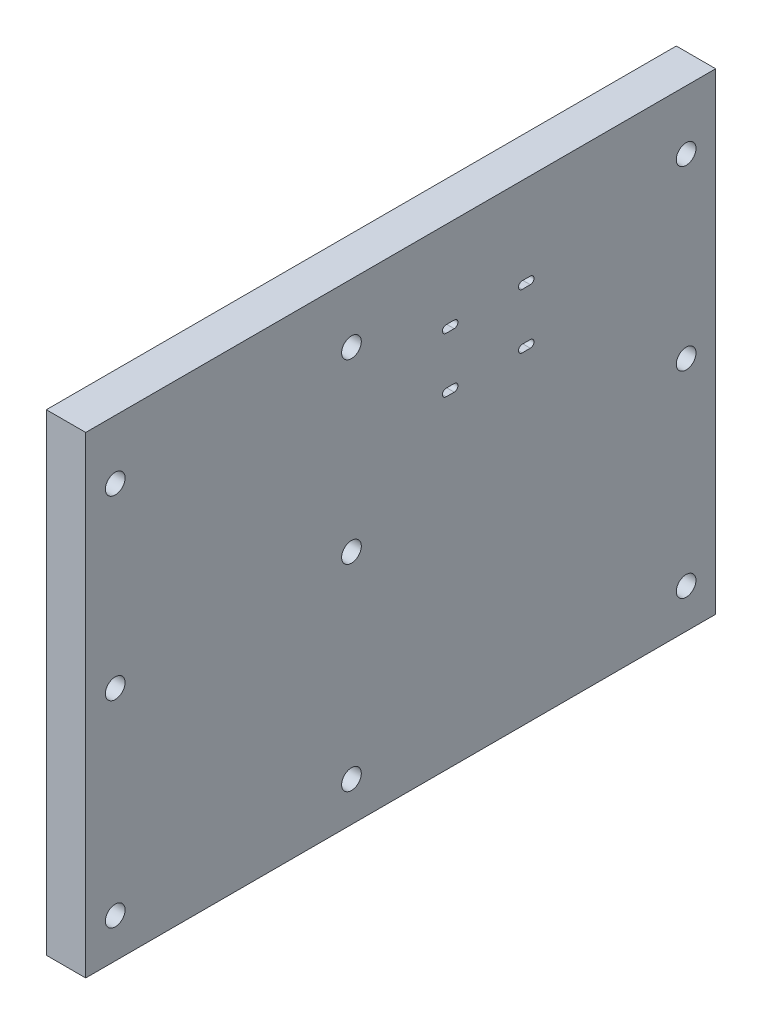
ISO-10303-21;
HEADER;
FILE_DESCRIPTION(('STEP AP214'),'2;1');
FILE_NAME('part.step','',(''),(''),'','','');
FILE_SCHEMA(('AUTOMOTIVE_DESIGN { 1 0 10303 214 1 1 1 1 }'));
ENDSEC;
DATA;
#1=APPLICATION_CONTEXT('core data for automotive mechanical design processes');
#2=APPLICATION_PROTOCOL_DEFINITION('international standard','automotive_design',2000,#1);
#3=PRODUCT_CONTEXT('',#1,'mechanical');
#4=PRODUCT('Part','Part','',(#3));
#5=PRODUCT_RELATED_PRODUCT_CATEGORY('part','',(#4));
#6=PRODUCT_DEFINITION_FORMATION('','',#4);
#7=PRODUCT_DEFINITION_CONTEXT('part definition',#1,'design');
#8=PRODUCT_DEFINITION('design','',#6,#7);
#9=PRODUCT_DEFINITION_SHAPE('','',#8);
#10=(LENGTH_UNIT() NAMED_UNIT(*) SI_UNIT(.MILLI.,.METRE.));
#11=(NAMED_UNIT(*) PLANE_ANGLE_UNIT() SI_UNIT($,.RADIAN.));
#12=(NAMED_UNIT(*) SI_UNIT($,.STERADIAN.) SOLID_ANGLE_UNIT());
#13=UNCERTAINTY_MEASURE_WITH_UNIT(LENGTH_MEASURE(1.E-05),#10,'distance_accuracy_value','');
#14=(GEOMETRIC_REPRESENTATION_CONTEXT(3) GLOBAL_UNCERTAINTY_ASSIGNED_CONTEXT((#13)) GLOBAL_UNIT_ASSIGNED_CONTEXT((#10,
#11,#12)) REPRESENTATION_CONTEXT('',''));
#15=CARTESIAN_POINT('',(0.,0.,0.));
#16=DIRECTION('',(0.,0.,1.));
#17=DIRECTION('',(1.,0.,0.));
#18=AXIS2_PLACEMENT_3D('',#15,#16,#17);
#19=CARTESIAN_POINT('',(12.7,46.97,-39.2012106466433));
#20=DIRECTION('',(-1.,0.,0.));
#21=DIRECTION('',(0.,0.,1.));
#22=AXIS2_PLACEMENT_3D('',#19,#20,#21);
#23=CYLINDRICAL_SURFACE('',#22,1.2);
#24=CARTESIAN_POINT('',(0.,46.97,-39.2012106466433));
#25=DIRECTION('',(1.,0.,0.));
#26=DIRECTION('',(0.,0.,-1.));
#27=AXIS2_PLACEMENT_3D('',#24,#25,#26);
#28=CIRCLE('',#27,1.2);
#29=CARTESIAN_POINT('',(0.,48.17,-39.2012106466433));
#30=VERTEX_POINT('',#29);
#31=CARTESIAN_POINT('',(0.,45.77,-39.2012106466433));
#32=VERTEX_POINT('',#31);
#33=EDGE_CURVE('E312',#30,#32,#28,.T.);
#34=ORIENTED_EDGE('',*,*,#33,.F.);
#35=DIRECTION('',(-1.,0.,0.));
#36=VECTOR('',#35,1.);
#37=CARTESIAN_POINT('',(12.7,48.17,-39.2012106466433));
#38=LINE('',#37,#36);
#39=CARTESIAN_POINT('',(12.7,48.17,-39.2012106466433));
#40=VERTEX_POINT('',#39);
#41=EDGE_CURVE('E11',#40,#30,#38,.T.);
#42=ORIENTED_EDGE('',*,*,#41,.F.);
#43=CARTESIAN_POINT('',(12.7,46.97,-39.2012106466433));
#44=DIRECTION('',(1.,0.,0.));
#45=DIRECTION('',(0.,0.,-1.));
#46=AXIS2_PLACEMENT_3D('',#43,#44,#45);
#47=CIRCLE('',#46,1.2);
#48=CARTESIAN_POINT('',(12.7,45.77,-39.2012106466433));
#49=VERTEX_POINT('',#48);
#50=EDGE_CURVE('E223',#40,#49,#47,.T.);
#51=ORIENTED_EDGE('',*,*,#50,.T.);
#52=DIRECTION('',(-1.,0.,0.));
#53=VECTOR('',#52,1.);
#54=CARTESIAN_POINT('',(12.7,45.77,-39.2012106466433));
#55=LINE('',#54,#53);
#56=EDGE_CURVE('E144',#49,#32,#55,.T.);
#57=ORIENTED_EDGE('',*,*,#56,.T.);
#58=EDGE_LOOP('',(#34,#42,#51,#57));
#59=FACE_BOUND('',#58,.T.);
#60=ADVANCED_FACE('F51',(#59),#23,.F.);
#61=CARTESIAN_POINT('',(12.7,48.17,0.));
#62=DIRECTION('',(0.,-1.,0.));
#63=DIRECTION('',(0.,0.,-1.));
#64=AXIS2_PLACEMENT_3D('',#61,#62,#63);
#65=PLANE('',#64);
#66=DIRECTION('',(0.,0.,1.));
#67=VECTOR('',#66,1.);
#68=CARTESIAN_POINT('',(0.,48.17,0.));
#69=LINE('',#68,#67);
#70=CARTESIAN_POINT('',(0.,48.17,-41.8012106466433));
#71=VERTEX_POINT('',#70);
#72=EDGE_CURVE('E215',#71,#30,#69,.T.);
#73=ORIENTED_EDGE('',*,*,#72,.F.);
#74=DIRECTION('',(-1.,0.,0.));
#75=VECTOR('',#74,1.);
#76=CARTESIAN_POINT('',(12.7,48.17,-41.8012106466433));
#77=LINE('',#76,#75);
#78=CARTESIAN_POINT('',(12.7,48.17,-41.8012106466433));
#79=VERTEX_POINT('',#78);
#80=EDGE_CURVE('E61',#79,#71,#77,.T.);
#81=ORIENTED_EDGE('',*,*,#80,.F.);
#82=DIRECTION('',(0.,0.,1.));
#83=VECTOR('',#82,1.);
#84=CARTESIAN_POINT('',(12.7,48.17,0.));
#85=LINE('',#84,#83);
#86=EDGE_CURVE('E213',#79,#40,#85,.T.);
#87=ORIENTED_EDGE('',*,*,#86,.T.);
#88=ORIENTED_EDGE('',*,*,#41,.T.);
#89=EDGE_LOOP('',(#73,#81,#87,#88));
#90=FACE_BOUND('',#89,.T.);
#91=ADVANCED_FACE('F212',(#90),#65,.T.);
#92=CARTESIAN_POINT('',(12.7,46.97,-41.8012106466433));
#93=DIRECTION('',(-1.,0.,0.));
#94=DIRECTION('',(0.,0.,1.));
#95=AXIS2_PLACEMENT_3D('',#92,#93,#94);
#96=CYLINDRICAL_SURFACE('',#95,1.2);
#97=CARTESIAN_POINT('',(0.,46.97,-41.8012106466433));
#98=DIRECTION('',(1.,0.,0.));
#99=DIRECTION('',(0.,0.,-1.));
#100=AXIS2_PLACEMENT_3D('',#97,#98,#99);
#101=CIRCLE('',#100,1.2);
#102=CARTESIAN_POINT('',(0.,45.77,-41.8012106466433));
#103=VERTEX_POINT('',#102);
#104=EDGE_CURVE('E316',#103,#71,#101,.T.);
#105=ORIENTED_EDGE('',*,*,#104,.F.);
#106=DIRECTION('',(-1.,0.,0.));
#107=VECTOR('',#106,1.);
#108=CARTESIAN_POINT('',(12.7,45.77,-41.8012106466433));
#109=LINE('',#108,#107);
#110=CARTESIAN_POINT('',(12.7,45.77,-41.8012106466433));
#111=VERTEX_POINT('',#110);
#112=EDGE_CURVE('E137',#111,#103,#109,.T.);
#113=ORIENTED_EDGE('',*,*,#112,.F.);
#114=CARTESIAN_POINT('',(12.7,46.97,-41.8012106466433));
#115=DIRECTION('',(1.,0.,0.));
#116=DIRECTION('',(0.,0.,-1.));
#117=AXIS2_PLACEMENT_3D('',#114,#115,#116);
#118=CIRCLE('',#117,1.2);
#119=EDGE_CURVE('E222',#111,#79,#118,.T.);
#120=ORIENTED_EDGE('',*,*,#119,.T.);
#121=ORIENTED_EDGE('',*,*,#80,.T.);
#122=EDGE_LOOP('',(#105,#113,#120,#121));
#123=FACE_BOUND('',#122,.T.);
#124=ADVANCED_FACE('F225',(#123),#96,.F.);
#125=CARTESIAN_POINT('',(12.7,30.43,0.));
#126=DIRECTION('',(0.,-1.,0.));
#127=DIRECTION('',(0.,0.,-1.));
#128=AXIS2_PLACEMENT_3D('',#125,#126,#127);
#129=PLANE('',#128);
#130=DIRECTION('',(0.,0.,1.));
#131=VECTOR('',#130,1.);
#132=CARTESIAN_POINT('',(0.,30.43,0.));
#133=LINE('',#132,#131);
#134=CARTESIAN_POINT('',(0.,30.43,-41.8012106466433));
#135=VERTEX_POINT('',#134);
#136=CARTESIAN_POINT('',(0.,30.43,-39.2012106466433));
#137=VERTEX_POINT('',#136);
#138=EDGE_CURVE('E299',#135,#137,#133,.T.);
#139=ORIENTED_EDGE('',*,*,#138,.F.);
#140=DIRECTION('',(-1.,0.,0.));
#141=VECTOR('',#140,1.);
#142=CARTESIAN_POINT('',(12.7,30.43,-41.8012106466433));
#143=LINE('',#142,#141);
#144=CARTESIAN_POINT('',(12.7,30.43,-41.8012106466433));
#145=VERTEX_POINT('',#144);
#146=EDGE_CURVE('E322',#145,#135,#143,.T.);
#147=ORIENTED_EDGE('',*,*,#146,.F.);
#148=DIRECTION('',(0.,0.,1.));
#149=VECTOR('',#148,1.);
#150=CARTESIAN_POINT('',(12.7,30.43,0.));
#151=LINE('',#150,#149);
#152=CARTESIAN_POINT('',(12.7,30.43,-39.2012106466433));
#153=VERTEX_POINT('',#152);
#154=EDGE_CURVE('E422',#145,#153,#151,.T.);
#155=ORIENTED_EDGE('',*,*,#154,.T.);
#156=DIRECTION('',(-1.,0.,0.));
#157=VECTOR('',#156,1.);
#158=CARTESIAN_POINT('',(12.7,30.43,-39.2012106466433));
#159=LINE('',#158,#157);
#160=EDGE_CURVE('E324',#153,#137,#159,.T.);
#161=ORIENTED_EDGE('',*,*,#160,.T.);
#162=EDGE_LOOP('',(#139,#147,#155,#161));
#163=FACE_BOUND('',#162,.T.);
#164=ADVANCED_FACE('F470',(#163),#129,.T.);
#165=CARTESIAN_POINT('',(12.7,29.23,-41.8012106466433));
#166=DIRECTION('',(-1.,0.,0.));
#167=DIRECTION('',(0.,0.,1.));
#168=AXIS2_PLACEMENT_3D('',#165,#166,#167);
#169=CYLINDRICAL_SURFACE('',#168,1.2);
#170=CARTESIAN_POINT('',(0.,29.23,-41.8012106466433));
#171=DIRECTION('',(1.,0.,0.));
#172=DIRECTION('',(0.,0.,-1.));
#173=AXIS2_PLACEMENT_3D('',#170,#171,#172);
#174=CIRCLE('',#173,1.2);
#175=CARTESIAN_POINT('',(0.,28.03,-41.8012106466433));
#176=VERTEX_POINT('',#175);
#177=EDGE_CURVE('E302',#135,#176,#174,.F.);
#178=ORIENTED_EDGE('',*,*,#177,.T.);
#179=DIRECTION('',(-1.,0.,0.));
#180=VECTOR('',#179,1.);
#181=CARTESIAN_POINT('',(12.7,28.03,-41.8012106466433));
#182=LINE('',#181,#180);
#183=CARTESIAN_POINT('',(12.7,28.03,-41.8012106466433));
#184=VERTEX_POINT('',#183);
#185=EDGE_CURVE('E332',#184,#176,#182,.T.);
#186=ORIENTED_EDGE('',*,*,#185,.F.);
#187=CARTESIAN_POINT('',(12.7,29.23,-41.8012106466433));
#188=DIRECTION('',(1.,0.,0.));
#189=DIRECTION('',(0.,0.,-1.));
#190=AXIS2_PLACEMENT_3D('',#187,#188,#189);
#191=CIRCLE('',#190,1.2);
#192=EDGE_CURVE('E426',#145,#184,#191,.F.);
#193=ORIENTED_EDGE('',*,*,#192,.F.);
#194=ORIENTED_EDGE('',*,*,#146,.T.);
#195=EDGE_LOOP('',(#178,#186,#193,#194));
#196=FACE_BOUND('',#195,.T.);
#197=ADVANCED_FACE('F466',(#196),#169,.F.);
#198=CARTESIAN_POINT('',(12.7,28.03,0.));
#199=DIRECTION('',(0.,-1.,0.));
#200=DIRECTION('',(0.,0.,-1.));
#201=AXIS2_PLACEMENT_3D('',#198,#199,#200);
#202=PLANE('',#201);
#203=DIRECTION('',(0.,0.,1.));
#204=VECTOR('',#203,1.);
#205=CARTESIAN_POINT('',(0.,28.03,0.));
#206=LINE('',#205,#204);
#207=CARTESIAN_POINT('',(0.,28.03,-39.2012106466433));
#208=VERTEX_POINT('',#207);
#209=EDGE_CURVE('E305',#176,#208,#206,.T.);
#210=ORIENTED_EDGE('',*,*,#209,.T.);
#211=DIRECTION('',(-1.,0.,0.));
#212=VECTOR('',#211,1.);
#213=CARTESIAN_POINT('',(12.7,28.03,-39.2012106466433));
#214=LINE('',#213,#212);
#215=CARTESIAN_POINT('',(12.7,28.03,-39.2012106466433));
#216=VERTEX_POINT('',#215);
#217=EDGE_CURVE('E327',#216,#208,#214,.T.);
#218=ORIENTED_EDGE('',*,*,#217,.F.);
#219=DIRECTION('',(0.,0.,1.));
#220=VECTOR('',#219,1.);
#221=CARTESIAN_POINT('',(12.7,28.03,0.));
#222=LINE('',#221,#220);
#223=EDGE_CURVE('E429',#184,#216,#222,.T.);
#224=ORIENTED_EDGE('',*,*,#223,.F.);
#225=ORIENTED_EDGE('',*,*,#185,.T.);
#226=EDGE_LOOP('',(#210,#218,#224,#225));
#227=FACE_BOUND('',#226,.T.);
#228=ADVANCED_FACE('F462',(#227),#202,.F.);
#229=CARTESIAN_POINT('',(12.7,45.77,0.));
#230=DIRECTION('',(0.,1.,0.));
#231=DIRECTION('',(0.,0.,1.));
#232=AXIS2_PLACEMENT_3D('',#229,#230,#231);
#233=PLANE('',#232);
#234=DIRECTION('',(0.,0.,-1.));
#235=VECTOR('',#234,1.);
#236=CARTESIAN_POINT('',(0.,45.77,0.));
#237=LINE('',#236,#235);
#238=CARTESIAN_POINT('',(0.,45.77,-14.6612106466434));
#239=VERTEX_POINT('',#238);
#240=CARTESIAN_POINT('',(0.,45.77,-17.2612106466434));
#241=VERTEX_POINT('',#240);
#242=EDGE_CURVE('E286',#239,#241,#237,.T.);
#243=ORIENTED_EDGE('',*,*,#242,.F.);
#244=DIRECTION('',(-1.,0.,0.));
#245=VECTOR('',#244,1.);
#246=CARTESIAN_POINT('',(12.7,45.77,-14.6612106466434));
#247=LINE('',#246,#245);
#248=CARTESIAN_POINT('',(12.7,45.77,-14.6612106466434));
#249=VERTEX_POINT('',#248);
#250=EDGE_CURVE('E328',#249,#239,#247,.T.);
#251=ORIENTED_EDGE('',*,*,#250,.F.);
#252=DIRECTION('',(0.,0.,-1.));
#253=VECTOR('',#252,1.);
#254=CARTESIAN_POINT('',(12.7,45.77,0.));
#255=LINE('',#254,#253);
#256=CARTESIAN_POINT('',(12.7,45.77,-17.2612106466434));
#257=VERTEX_POINT('',#256);
#258=EDGE_CURVE('E409',#249,#257,#255,.T.);
#259=ORIENTED_EDGE('',*,*,#258,.T.);
#260=DIRECTION('',(-1.,0.,0.));
#261=VECTOR('',#260,1.);
#262=CARTESIAN_POINT('',(12.7,45.77,-17.2612106466434));
#263=LINE('',#262,#261);
#264=EDGE_CURVE('E336',#257,#241,#263,.T.);
#265=ORIENTED_EDGE('',*,*,#264,.T.);
#266=EDGE_LOOP('',(#243,#251,#259,#265));
#267=FACE_BOUND('',#266,.T.);
#268=ADVANCED_FACE('F465',(#267),#233,.T.);
#269=CARTESIAN_POINT('',(12.7,46.97,-14.6612106466434));
#270=DIRECTION('',(-1.,0.,0.));
#271=DIRECTION('',(0.,0.,1.));
#272=AXIS2_PLACEMENT_3D('',#269,#270,#271);
#273=CYLINDRICAL_SURFACE('',#272,1.2);
#274=CARTESIAN_POINT('',(0.,46.97,-14.6612106466434));
#275=DIRECTION('',(1.,0.,0.));
#276=DIRECTION('',(0.,0.,-1.));
#277=AXIS2_PLACEMENT_3D('',#274,#275,#276);
#278=CIRCLE('',#277,1.2);
#279=CARTESIAN_POINT('',(0.,48.17,-14.6612106466434));
#280=VERTEX_POINT('',#279);
#281=EDGE_CURVE('E289',#239,#280,#278,.F.);
#282=ORIENTED_EDGE('',*,*,#281,.T.);
#283=DIRECTION('',(-1.,0.,0.));
#284=VECTOR('',#283,1.);
#285=CARTESIAN_POINT('',(12.7,48.17,-14.6612106466434));
#286=LINE('',#285,#284);
#287=CARTESIAN_POINT('',(12.7,48.17,-14.6612106466434));
#288=VERTEX_POINT('',#287);
#289=EDGE_CURVE('E343',#288,#280,#286,.T.);
#290=ORIENTED_EDGE('',*,*,#289,.F.);
#291=CARTESIAN_POINT('',(12.7,46.97,-14.6612106466434));
#292=DIRECTION('',(1.,0.,0.));
#293=DIRECTION('',(0.,0.,-1.));
#294=AXIS2_PLACEMENT_3D('',#291,#292,#293);
#295=CIRCLE('',#294,1.2);
#296=EDGE_CURVE('E412',#249,#288,#295,.F.);
#297=ORIENTED_EDGE('',*,*,#296,.F.);
#298=ORIENTED_EDGE('',*,*,#250,.T.);
#299=EDGE_LOOP('',(#282,#290,#297,#298));
#300=FACE_BOUND('',#299,.T.);
#301=ADVANCED_FACE('F483',(#300),#273,.F.);
#302=CARTESIAN_POINT('',(12.7,48.17,0.));
#303=DIRECTION('',(0.,1.,0.));
#304=DIRECTION('',(0.,0.,1.));
#305=AXIS2_PLACEMENT_3D('',#302,#303,#304);
#306=PLANE('',#305);
#307=DIRECTION('',(0.,0.,-1.));
#308=VECTOR('',#307,1.);
#309=CARTESIAN_POINT('',(0.,48.17,0.));
#310=LINE('',#309,#308);
#311=CARTESIAN_POINT('',(0.,48.17,-17.2612106466434));
#312=VERTEX_POINT('',#311);
#313=EDGE_CURVE('E292',#280,#312,#310,.T.);
#314=ORIENTED_EDGE('',*,*,#313,.T.);
#315=DIRECTION('',(-1.,0.,0.));
#316=VECTOR('',#315,1.);
#317=CARTESIAN_POINT('',(12.7,48.17,-17.2612106466434));
#318=LINE('',#317,#316);
#319=CARTESIAN_POINT('',(12.7,48.17,-17.2612106466434));
#320=VERTEX_POINT('',#319);
#321=EDGE_CURVE('E338',#320,#312,#318,.T.);
#322=ORIENTED_EDGE('',*,*,#321,.F.);
#323=DIRECTION('',(0.,0.,-1.));
#324=VECTOR('',#323,1.);
#325=CARTESIAN_POINT('',(12.7,48.17,0.));
#326=LINE('',#325,#324);
#327=EDGE_CURVE('E415',#288,#320,#326,.T.);
#328=ORIENTED_EDGE('',*,*,#327,.F.);
#329=ORIENTED_EDGE('',*,*,#289,.T.);
#330=EDGE_LOOP('',(#314,#322,#328,#329));
#331=FACE_BOUND('',#330,.T.);
#332=ADVANCED_FACE('F479',(#331),#306,.F.);
#333=CARTESIAN_POINT('',(12.7,29.23,-17.2612106466435));
#334=DIRECTION('',(-1.,0.,0.));
#335=DIRECTION('',(0.,0.,1.));
#336=AXIS2_PLACEMENT_3D('',#333,#334,#335);
#337=CYLINDRICAL_SURFACE('',#336,1.2);
#338=CARTESIAN_POINT('',(0.,29.23,-17.2612106466435));
#339=DIRECTION('',(1.,0.,0.));
#340=DIRECTION('',(0.,0.,-1.));
#341=AXIS2_PLACEMENT_3D('',#338,#339,#340);
#342=CIRCLE('',#341,1.2);
#343=CARTESIAN_POINT('',(0.,28.03,-17.2612106466434));
#344=VERTEX_POINT('',#343);
#345=CARTESIAN_POINT('',(0.,30.43,-17.2612106466434));
#346=VERTEX_POINT('',#345);
#347=EDGE_CURVE('E270',#344,#346,#342,.T.);
#348=ORIENTED_EDGE('',*,*,#347,.F.);
#349=DIRECTION('',(-1.,0.,0.));
#350=VECTOR('',#349,1.);
#351=CARTESIAN_POINT('',(12.7,28.03,-17.2612106466434));
#352=LINE('',#351,#350);
#353=CARTESIAN_POINT('',(12.7,28.03,-17.2612106466434));
#354=VERTEX_POINT('',#353);
#355=EDGE_CURVE('E339',#354,#344,#352,.T.);
#356=ORIENTED_EDGE('',*,*,#355,.F.);
#357=CARTESIAN_POINT('',(12.7,29.23,-17.2612106466435));
#358=DIRECTION('',(1.,0.,0.));
#359=DIRECTION('',(0.,0.,-1.));
#360=AXIS2_PLACEMENT_3D('',#357,#358,#359);
#361=CIRCLE('',#360,1.2);
#362=CARTESIAN_POINT('',(12.7,30.43,-17.2612106466434));
#363=VERTEX_POINT('',#362);
#364=EDGE_CURVE('E386',#354,#363,#361,.T.);
#365=ORIENTED_EDGE('',*,*,#364,.T.);
#366=DIRECTION('',(-1.,0.,0.));
#367=VECTOR('',#366,1.);
#368=CARTESIAN_POINT('',(12.7,30.43,-17.2612106466434));
#369=LINE('',#368,#367);
#370=EDGE_CURVE('E347',#363,#346,#369,.T.);
#371=ORIENTED_EDGE('',*,*,#370,.T.);
#372=EDGE_LOOP('',(#348,#356,#365,#371));
#373=FACE_BOUND('',#372,.T.);
#374=ADVANCED_FACE('F482',(#373),#337,.F.);
#375=CARTESIAN_POINT('',(12.7,28.03,0.));
#376=DIRECTION('',(0.,1.,0.));
#377=DIRECTION('',(0.,0.,1.));
#378=AXIS2_PLACEMENT_3D('',#375,#376,#377);
#379=PLANE('',#378);
#380=DIRECTION('',(0.,0.,-1.));
#381=VECTOR('',#380,1.);
#382=CARTESIAN_POINT('',(0.,28.03,0.));
#383=LINE('',#382,#381);
#384=CARTESIAN_POINT('',(0.,28.03,-14.6612106466434));
#385=VERTEX_POINT('',#384);
#386=EDGE_CURVE('E274',#385,#344,#383,.T.);
#387=ORIENTED_EDGE('',*,*,#386,.F.);
#388=DIRECTION('',(-1.,0.,0.));
#389=VECTOR('',#388,1.);
#390=CARTESIAN_POINT('',(12.7,28.03,-14.6612106466434));
#391=LINE('',#390,#389);
#392=CARTESIAN_POINT('',(12.7,28.03,-14.6612106466434));
#393=VERTEX_POINT('',#392);
#394=EDGE_CURVE('E353',#393,#385,#391,.T.);
#395=ORIENTED_EDGE('',*,*,#394,.F.);
#396=DIRECTION('',(0.,0.,-1.));
#397=VECTOR('',#396,1.);
#398=CARTESIAN_POINT('',(12.7,28.03,0.));
#399=LINE('',#398,#397);
#400=EDGE_CURVE('E398',#393,#354,#399,.T.);
#401=ORIENTED_EDGE('',*,*,#400,.T.);
#402=ORIENTED_EDGE('',*,*,#355,.T.);
#403=EDGE_LOOP('',(#387,#395,#401,#402));
#404=FACE_BOUND('',#403,.T.);
#405=ADVANCED_FACE('F497',(#404),#379,.T.);
#406=CARTESIAN_POINT('',(12.7,29.23,-14.6612106466434));
#407=DIRECTION('',(-1.,0.,0.));
#408=DIRECTION('',(0.,0.,1.));
#409=AXIS2_PLACEMENT_3D('',#406,#407,#408);
#410=CYLINDRICAL_SURFACE('',#409,1.2);
#411=CARTESIAN_POINT('',(0.,29.23,-14.6612106466434));
#412=DIRECTION('',(1.,0.,0.));
#413=DIRECTION('',(0.,0.,-1.));
#414=AXIS2_PLACEMENT_3D('',#411,#412,#413);
#415=CIRCLE('',#414,1.2);
#416=CARTESIAN_POINT('',(0.,30.43,-14.6612106466434));
#417=VERTEX_POINT('',#416);
#418=EDGE_CURVE('E278',#417,#385,#415,.T.);
#419=ORIENTED_EDGE('',*,*,#418,.F.);
#420=DIRECTION('',(-1.,0.,0.));
#421=VECTOR('',#420,1.);
#422=CARTESIAN_POINT('',(12.7,30.43,-14.6612106466434));
#423=LINE('',#422,#421);
#424=CARTESIAN_POINT('',(12.7,30.43,-14.6612106466434));
#425=VERTEX_POINT('',#424);
#426=EDGE_CURVE('E350',#425,#417,#423,.T.);
#427=ORIENTED_EDGE('',*,*,#426,.F.);
#428=CARTESIAN_POINT('',(12.7,29.23,-14.6612106466434));
#429=DIRECTION('',(1.,0.,0.));
#430=DIRECTION('',(0.,0.,-1.));
#431=AXIS2_PLACEMENT_3D('',#428,#429,#430);
#432=CIRCLE('',#431,1.2);
#433=EDGE_CURVE('E402',#425,#393,#432,.T.);
#434=ORIENTED_EDGE('',*,*,#433,.T.);
#435=ORIENTED_EDGE('',*,*,#394,.T.);
#436=EDGE_LOOP('',(#419,#427,#434,#435));
#437=FACE_BOUND('',#436,.T.);
#438=ADVANCED_FACE('F494',(#437),#410,.F.);
#439=CARTESIAN_POINT('',(12.7,0.,-101.6));
#440=DIRECTION('',(0.,0.,1.));
#441=DIRECTION('',(1.,0.,0.));
#442=AXIS2_PLACEMENT_3D('',#439,#440,#441);
#443=PLANE('',#442);
#444=DIRECTION('',(0.,1.,0.));
#445=VECTOR('',#444,1.);
#446=CARTESIAN_POINT('',(0.,0.,-101.6));
#447=LINE('',#446,#445);
#448=CARTESIAN_POINT('',(0.,-76.2,-101.6));
#449=VERTEX_POINT('',#448);
#450=CARTESIAN_POINT('',(0.,76.2,-101.6));
#451=VERTEX_POINT('',#450);
#452=EDGE_CURVE('E258',#449,#451,#447,.T.);
#453=ORIENTED_EDGE('',*,*,#452,.T.);
#454=DIRECTION('',(-1.,0.,0.));
#455=VECTOR('',#454,1.);
#456=CARTESIAN_POINT('',(12.7,76.2,-101.6));
#457=LINE('',#456,#455);
#458=CARTESIAN_POINT('',(12.7,76.2,-101.6));
#459=VERTEX_POINT('',#458);
#460=EDGE_CURVE('E55',#459,#451,#457,.T.);
#461=ORIENTED_EDGE('',*,*,#460,.F.);
#462=DIRECTION('',(0.,1.,0.));
#463=VECTOR('',#462,1.);
#464=CARTESIAN_POINT('',(12.7,0.,-101.6));
#465=LINE('',#464,#463);
#466=CARTESIAN_POINT('',(12.7,-76.2,-101.6));
#467=VERTEX_POINT('',#466);
#468=EDGE_CURVE('E152',#467,#459,#465,.T.);
#469=ORIENTED_EDGE('',*,*,#468,.F.);
#470=DIRECTION('',(-1.,0.,0.));
#471=VECTOR('',#470,1.);
#472=CARTESIAN_POINT('',(12.7,-76.2,-101.6));
#473=LINE('',#472,#471);
#474=EDGE_CURVE('E227',#467,#449,#473,.T.);
#475=ORIENTED_EDGE('',*,*,#474,.T.);
#476=EDGE_LOOP('',(#453,#461,#469,#475));
#477=FACE_BOUND('',#476,.T.);
#478=ADVANCED_FACE('F372',(#477),#443,.F.);
#479=CARTESIAN_POINT('',(12.7,76.2,0.));
#480=DIRECTION('',(0.,1.,0.));
#481=DIRECTION('',(0.,0.,1.));
#482=AXIS2_PLACEMENT_3D('',#479,#480,#481);
#483=PLANE('',#482);
#484=DIRECTION('',(0.,0.,-1.));
#485=VECTOR('',#484,1.);
#486=CARTESIAN_POINT('',(0.,76.2,0.));
#487=LINE('',#486,#485);
#488=CARTESIAN_POINT('',(0.,76.2,101.6));
#489=VERTEX_POINT('',#488);
#490=EDGE_CURVE('E261',#489,#451,#487,.T.);
#491=ORIENTED_EDGE('',*,*,#490,.F.);
#492=DIRECTION('',(-1.,0.,0.));
#493=VECTOR('',#492,1.);
#494=CARTESIAN_POINT('',(12.7,76.2,101.6));
#495=LINE('',#494,#493);
#496=CARTESIAN_POINT('',(12.7,76.2,101.6));
#497=VERTEX_POINT('',#496);
#498=EDGE_CURVE('E361',#497,#489,#495,.T.);
#499=ORIENTED_EDGE('',*,*,#498,.F.);
#500=DIRECTION('',(0.,0.,-1.));
#501=VECTOR('',#500,1.);
#502=CARTESIAN_POINT('',(12.7,76.2,0.));
#503=LINE('',#502,#501);
#504=EDGE_CURVE('E369',#497,#459,#503,.T.);
#505=ORIENTED_EDGE('',*,*,#504,.T.);
#506=ORIENTED_EDGE('',*,*,#460,.T.);
#507=EDGE_LOOP('',(#491,#499,#505,#506));
#508=FACE_BOUND('',#507,.T.);
#509=ADVANCED_FACE('F368',(#508),#483,.T.);
#510=CARTESIAN_POINT('',(12.7,0.,101.6));
#511=DIRECTION('',(0.,0.,1.));
#512=DIRECTION('',(1.,0.,0.));
#513=AXIS2_PLACEMENT_3D('',#510,#511,#512);
#514=PLANE('',#513);
#515=DIRECTION('',(0.,1.,0.));
#516=VECTOR('',#515,1.);
#517=CARTESIAN_POINT('',(0.,0.,101.6));
#518=LINE('',#517,#516);
#519=CARTESIAN_POINT('',(0.,-76.2,101.6));
#520=VERTEX_POINT('',#519);
#521=EDGE_CURVE('E264',#520,#489,#518,.T.);
#522=ORIENTED_EDGE('',*,*,#521,.F.);
#523=DIRECTION('',(-1.,0.,0.));
#524=VECTOR('',#523,1.);
#525=CARTESIAN_POINT('',(12.7,-76.2,101.6));
#526=LINE('',#525,#524);
#527=CARTESIAN_POINT('',(12.7,-76.2,101.6));
#528=VERTEX_POINT('',#527);
#529=EDGE_CURVE('E360',#528,#520,#526,.T.);
#530=ORIENTED_EDGE('',*,*,#529,.F.);
#531=DIRECTION('',(0.,1.,0.));
#532=VECTOR('',#531,1.);
#533=CARTESIAN_POINT('',(12.7,0.,101.6));
#534=LINE('',#533,#532);
#535=EDGE_CURVE('E381',#528,#497,#534,.T.);
#536=ORIENTED_EDGE('',*,*,#535,.T.);
#537=ORIENTED_EDGE('',*,*,#498,.T.);
#538=EDGE_LOOP('',(#522,#530,#536,#537));
#539=FACE_BOUND('',#538,.T.);
#540=ADVANCED_FACE('F378',(#539),#514,.T.);
#541=CARTESIAN_POINT('',(12.7,29.23,-39.2012106466432));
#542=DIRECTION('',(-1.,0.,0.));
#543=DIRECTION('',(0.,0.,1.));
#544=AXIS2_PLACEMENT_3D('',#541,#542,#543);
#545=CYLINDRICAL_SURFACE('',#544,1.2);
#546=CARTESIAN_POINT('',(0.,29.23,-39.2012106466432));
#547=DIRECTION('',(1.,0.,0.));
#548=DIRECTION('',(0.,0.,-1.));
#549=AXIS2_PLACEMENT_3D('',#546,#547,#548);
#550=CIRCLE('',#549,1.2);
#551=EDGE_CURVE('E308',#208,#137,#550,.F.);
#552=ORIENTED_EDGE('',*,*,#551,.T.);
#553=ORIENTED_EDGE('',*,*,#160,.F.);
#554=CARTESIAN_POINT('',(12.7,29.23,-39.2012106466432));
#555=DIRECTION('',(1.,0.,0.));
#556=DIRECTION('',(0.,0.,-1.));
#557=AXIS2_PLACEMENT_3D('',#554,#555,#556);
#558=CIRCLE('',#557,1.2);
#559=EDGE_CURVE('E433',#216,#153,#558,.F.);
#560=ORIENTED_EDGE('',*,*,#559,.F.);
#561=ORIENTED_EDGE('',*,*,#217,.T.);
#562=EDGE_LOOP('',(#552,#553,#560,#561));
#563=FACE_BOUND('',#562,.T.);
#564=ADVANCED_FACE('F457',(#563),#545,.F.);
#565=CARTESIAN_POINT('',(12.7,46.97,-17.2612106466434));
#566=DIRECTION('',(-1.,0.,0.));
#567=DIRECTION('',(0.,0.,1.));
#568=AXIS2_PLACEMENT_3D('',#565,#566,#567);
#569=CYLINDRICAL_SURFACE('',#568,1.2);
#570=CARTESIAN_POINT('',(0.,46.97,-17.2612106466434));
#571=DIRECTION('',(1.,0.,0.));
#572=DIRECTION('',(0.,0.,-1.));
#573=AXIS2_PLACEMENT_3D('',#570,#571,#572);
#574=CIRCLE('',#573,1.2);
#575=EDGE_CURVE('E295',#312,#241,#574,.F.);
#576=ORIENTED_EDGE('',*,*,#575,.T.);
#577=ORIENTED_EDGE('',*,*,#264,.F.);
#578=CARTESIAN_POINT('',(12.7,46.97,-17.2612106466434));
#579=DIRECTION('',(1.,0.,0.));
#580=DIRECTION('',(0.,0.,-1.));
#581=AXIS2_PLACEMENT_3D('',#578,#579,#580);
#582=CIRCLE('',#581,1.2);
#583=EDGE_CURVE('E419',#320,#257,#582,.F.);
#584=ORIENTED_EDGE('',*,*,#583,.F.);
#585=ORIENTED_EDGE('',*,*,#321,.T.);
#586=EDGE_LOOP('',(#576,#577,#584,#585));
#587=FACE_BOUND('',#586,.T.);
#588=ADVANCED_FACE('F460',(#587),#569,.F.);
#589=CARTESIAN_POINT('',(12.7,30.43,0.));
#590=DIRECTION('',(0.,1.,0.));
#591=DIRECTION('',(0.,0.,1.));
#592=AXIS2_PLACEMENT_3D('',#589,#590,#591);
#593=PLANE('',#592);
#594=DIRECTION('',(0.,0.,-1.));
#595=VECTOR('',#594,1.);
#596=CARTESIAN_POINT('',(0.,30.43,0.));
#597=LINE('',#596,#595);
#598=EDGE_CURVE('E282',#417,#346,#597,.T.);
#599=ORIENTED_EDGE('',*,*,#598,.T.);
#600=ORIENTED_EDGE('',*,*,#370,.F.);
#601=DIRECTION('',(0.,0.,-1.));
#602=VECTOR('',#601,1.);
#603=CARTESIAN_POINT('',(12.7,30.43,0.));
#604=LINE('',#603,#602);
#605=EDGE_CURVE('E406',#425,#363,#604,.T.);
#606=ORIENTED_EDGE('',*,*,#605,.F.);
#607=ORIENTED_EDGE('',*,*,#426,.T.);
#608=EDGE_LOOP('',(#599,#600,#606,#607));
#609=FACE_BOUND('',#608,.T.);
#610=ADVANCED_FACE('F477',(#609),#593,.F.);
#611=CARTESIAN_POINT('',(12.7,-76.2,0.));
#612=DIRECTION('',(0.,1.,0.));
#613=DIRECTION('',(0.,0.,1.));
#614=AXIS2_PLACEMENT_3D('',#611,#612,#613);
#615=PLANE('',#614);
#616=DIRECTION('',(0.,0.,-1.));
#617=VECTOR('',#616,1.);
#618=CARTESIAN_POINT('',(0.,-76.2,0.));
#619=LINE('',#618,#617);
#620=EDGE_CURVE('E267',#520,#449,#619,.T.);
#621=ORIENTED_EDGE('',*,*,#620,.T.);
#622=ORIENTED_EDGE('',*,*,#474,.F.);
#623=DIRECTION('',(0.,0.,-1.));
#624=VECTOR('',#623,1.);
#625=CARTESIAN_POINT('',(12.7,-76.2,0.));
#626=LINE('',#625,#624);
#627=EDGE_CURVE('E383',#528,#467,#626,.T.);
#628=ORIENTED_EDGE('',*,*,#627,.F.);
#629=ORIENTED_EDGE('',*,*,#529,.T.);
#630=EDGE_LOOP('',(#621,#622,#628,#629));
#631=FACE_BOUND('',#630,.T.);
#632=ADVANCED_FACE('F384',(#631),#615,.F.);
#633=CARTESIAN_POINT('',(12.7,-63.5,92.075));
#634=DIRECTION('',(-1.,0.,0.));
#635=DIRECTION('',(0.,0.,1.));
#636=AXIS2_PLACEMENT_3D('',#633,#634,#635);
#637=CYLINDRICAL_SURFACE('',#636,3.175);
#638=CARTESIAN_POINT('',(12.7,-63.5,92.075));
#639=DIRECTION('',(1.,0.,0.));
#640=DIRECTION('',(0.,0.,-1.));
#641=AXIS2_PLACEMENT_3D('',#638,#639,#640);
#642=CIRCLE('',#641,3.175);
#643=CARTESIAN_POINT('',(12.7,-63.5,88.9));
#644=VERTEX_POINT('',#643);
#645=EDGE_CURVE('E848',#644,#644,#642,.T.);
#646=ORIENTED_EDGE('',*,*,#645,.T.);
#647=EDGE_LOOP('',(#646));
#648=FACE_BOUND('',#647,.T.);
#649=CARTESIAN_POINT('',(0.,-63.5,92.075));
#650=DIRECTION('',(1.,0.,0.));
#651=DIRECTION('',(0.,0.,-1.));
#652=AXIS2_PLACEMENT_3D('',#649,#650,#651);
#653=CIRCLE('',#652,3.175);
#654=CARTESIAN_POINT('',(0.,-63.5,88.9));
#655=VERTEX_POINT('',#654);
#656=EDGE_CURVE('E255',#655,#655,#653,.T.);
#657=ORIENTED_EDGE('',*,*,#656,.F.);
#658=EDGE_LOOP('',(#657));
#659=FACE_BOUND('',#658,.T.);
#660=ADVANCED_FACE('F507',(#648,#659),#637,.F.);
#661=CARTESIAN_POINT('',(12.7,-63.5,15.875));
#662=DIRECTION('',(-1.,0.,0.));
#663=DIRECTION('',(0.,0.,1.));
#664=AXIS2_PLACEMENT_3D('',#661,#662,#663);
#665=CYLINDRICAL_SURFACE('',#664,3.175);
#666=CARTESIAN_POINT('',(12.7,-63.5,15.875));
#667=DIRECTION('',(1.,0.,0.));
#668=DIRECTION('',(0.,0.,-1.));
#669=AXIS2_PLACEMENT_3D('',#666,#667,#668);
#670=CIRCLE('',#669,3.175);
#671=CARTESIAN_POINT('',(12.7,-63.5,12.7));
#672=VERTEX_POINT('',#671);
#673=EDGE_CURVE('E844',#672,#672,#670,.T.);
#674=ORIENTED_EDGE('',*,*,#673,.T.);
#675=EDGE_LOOP('',(#674));
#676=FACE_BOUND('',#675,.T.);
#677=CARTESIAN_POINT('',(0.,-63.5,15.875));
#678=DIRECTION('',(1.,0.,0.));
#679=DIRECTION('',(0.,0.,-1.));
#680=AXIS2_PLACEMENT_3D('',#677,#678,#679);
#681=CIRCLE('',#680,3.175);
#682=CARTESIAN_POINT('',(0.,-63.5,12.7));
#683=VERTEX_POINT('',#682);
#684=EDGE_CURVE('E252',#683,#683,#681,.T.);
#685=ORIENTED_EDGE('',*,*,#684,.F.);
#686=EDGE_LOOP('',(#685));
#687=FACE_BOUND('',#686,.T.);
#688=ADVANCED_FACE('F516',(#676,#687),#665,.F.);
#689=CARTESIAN_POINT('',(12.7,-63.5,-92.075));
#690=DIRECTION('',(-1.,0.,0.));
#691=DIRECTION('',(0.,0.,1.));
#692=AXIS2_PLACEMENT_3D('',#689,#690,#691);
#693=CYLINDRICAL_SURFACE('',#692,3.175);
#694=CARTESIAN_POINT('',(12.7,-63.5,-92.075));
#695=DIRECTION('',(1.,0.,0.));
#696=DIRECTION('',(0.,0.,-1.));
#697=AXIS2_PLACEMENT_3D('',#694,#695,#696);
#698=CIRCLE('',#697,3.175);
#699=CARTESIAN_POINT('',(12.7,-63.5,-95.25));
#700=VERTEX_POINT('',#699);
#701=EDGE_CURVE('E841',#700,#700,#698,.T.);
#702=ORIENTED_EDGE('',*,*,#701,.T.);
#703=EDGE_LOOP('',(#702));
#704=FACE_BOUND('',#703,.T.);
#705=CARTESIAN_POINT('',(0.,-63.5,-92.075));
#706=DIRECTION('',(1.,0.,0.));
#707=DIRECTION('',(0.,0.,-1.));
#708=AXIS2_PLACEMENT_3D('',#705,#706,#707);
#709=CIRCLE('',#708,3.175);
#710=CARTESIAN_POINT('',(0.,-63.5,-95.25));
#711=VERTEX_POINT('',#710);
#712=EDGE_CURVE('E249',#711,#711,#709,.T.);
#713=ORIENTED_EDGE('',*,*,#712,.F.);
#714=EDGE_LOOP('',(#713));
#715=FACE_BOUND('',#714,.T.);
#716=ADVANCED_FACE('F520',(#704,#715),#693,.F.);
#717=CARTESIAN_POINT('',(12.7,0.,15.875));
#718=DIRECTION('',(-1.,0.,0.));
#719=DIRECTION('',(0.,0.,1.));
#720=AXIS2_PLACEMENT_3D('',#717,#718,#719);
#721=CYLINDRICAL_SURFACE('',#720,3.175);
#722=CARTESIAN_POINT('',(12.7,0.,15.875));
#723=DIRECTION('',(1.,0.,0.));
#724=DIRECTION('',(0.,0.,-1.));
#725=AXIS2_PLACEMENT_3D('',#722,#723,#724);
#726=CIRCLE('',#725,3.175);
#727=CARTESIAN_POINT('',(12.7,0.,12.7));
#728=VERTEX_POINT('',#727);
#729=EDGE_CURVE('E838',#728,#728,#726,.T.);
#730=ORIENTED_EDGE('',*,*,#729,.T.);
#731=EDGE_LOOP('',(#730));
#732=FACE_BOUND('',#731,.T.);
#733=CARTESIAN_POINT('',(0.,0.,15.875));
#734=DIRECTION('',(1.,0.,0.));
#735=DIRECTION('',(0.,0.,-1.));
#736=AXIS2_PLACEMENT_3D('',#733,#734,#735);
#737=CIRCLE('',#736,3.175);
#738=CARTESIAN_POINT('',(0.,0.,12.7));
#739=VERTEX_POINT('',#738);
#740=EDGE_CURVE('E246',#739,#739,#737,.T.);
#741=ORIENTED_EDGE('',*,*,#740,.F.);
#742=EDGE_LOOP('',(#741));
#743=FACE_BOUND('',#742,.T.);
#744=ADVANCED_FACE('F524',(#732,#743),#721,.F.);
#745=CARTESIAN_POINT('',(12.7,0.,92.075));
#746=DIRECTION('',(-1.,0.,0.));
#747=DIRECTION('',(0.,0.,1.));
#748=AXIS2_PLACEMENT_3D('',#745,#746,#747);
#749=CYLINDRICAL_SURFACE('',#748,3.175);
#750=CARTESIAN_POINT('',(12.7,0.,92.075));
#751=DIRECTION('',(1.,0.,0.));
#752=DIRECTION('',(0.,0.,-1.));
#753=AXIS2_PLACEMENT_3D('',#750,#751,#752);
#754=CIRCLE('',#753,3.175);
#755=CARTESIAN_POINT('',(12.7,0.,88.9));
#756=VERTEX_POINT('',#755);
#757=EDGE_CURVE('E835',#756,#756,#754,.T.);
#758=ORIENTED_EDGE('',*,*,#757,.T.);
#759=EDGE_LOOP('',(#758));
#760=FACE_BOUND('',#759,.T.);
#761=CARTESIAN_POINT('',(0.,0.,92.075));
#762=DIRECTION('',(1.,0.,0.));
#763=DIRECTION('',(0.,0.,-1.));
#764=AXIS2_PLACEMENT_3D('',#761,#762,#763);
#765=CIRCLE('',#764,3.175);
#766=CARTESIAN_POINT('',(0.,0.,88.9));
#767=VERTEX_POINT('',#766);
#768=EDGE_CURVE('E243',#767,#767,#765,.T.);
#769=ORIENTED_EDGE('',*,*,#768,.F.);
#770=EDGE_LOOP('',(#769));
#771=FACE_BOUND('',#770,.T.);
#772=ADVANCED_FACE('F528',(#760,#771),#749,.F.);
#773=CARTESIAN_POINT('',(12.7,57.15,92.075));
#774=DIRECTION('',(-1.,0.,0.));
#775=DIRECTION('',(0.,0.,1.));
#776=AXIS2_PLACEMENT_3D('',#773,#774,#775);
#777=CYLINDRICAL_SURFACE('',#776,3.175);
#778=CARTESIAN_POINT('',(12.7,57.15,92.075));
#779=DIRECTION('',(1.,0.,0.));
#780=DIRECTION('',(0.,0.,-1.));
#781=AXIS2_PLACEMENT_3D('',#778,#779,#780);
#782=CIRCLE('',#781,3.175);
#783=CARTESIAN_POINT('',(12.7,57.15,88.9));
#784=VERTEX_POINT('',#783);
#785=EDGE_CURVE('E828',#784,#784,#782,.T.);
#786=ORIENTED_EDGE('',*,*,#785,.T.);
#787=EDGE_LOOP('',(#786));
#788=FACE_BOUND('',#787,.T.);
#789=CARTESIAN_POINT('',(0.,57.15,92.075));
#790=DIRECTION('',(1.,0.,0.));
#791=DIRECTION('',(0.,0.,-1.));
#792=AXIS2_PLACEMENT_3D('',#789,#790,#791);
#793=CIRCLE('',#792,3.175);
#794=CARTESIAN_POINT('',(0.,57.15,88.9));
#795=VERTEX_POINT('',#794);
#796=EDGE_CURVE('E240',#795,#795,#793,.T.);
#797=ORIENTED_EDGE('',*,*,#796,.F.);
#798=EDGE_LOOP('',(#797));
#799=FACE_BOUND('',#798,.T.);
#800=ADVANCED_FACE('F532',(#788,#799),#777,.F.);
#801=CARTESIAN_POINT('',(12.7,57.15,15.875));
#802=DIRECTION('',(-1.,0.,0.));
#803=DIRECTION('',(0.,0.,1.));
#804=AXIS2_PLACEMENT_3D('',#801,#802,#803);
#805=CYLINDRICAL_SURFACE('',#804,3.175);
#806=CARTESIAN_POINT('',(12.7,57.15,15.875));
#807=DIRECTION('',(1.,0.,0.));
#808=DIRECTION('',(0.,0.,-1.));
#809=AXIS2_PLACEMENT_3D('',#806,#807,#808);
#810=CIRCLE('',#809,3.175);
#811=CARTESIAN_POINT('',(12.7,57.15,12.7));
#812=VERTEX_POINT('',#811);
#813=EDGE_CURVE('E825',#812,#812,#810,.T.);
#814=ORIENTED_EDGE('',*,*,#813,.T.);
#815=EDGE_LOOP('',(#814));
#816=FACE_BOUND('',#815,.T.);
#817=CARTESIAN_POINT('',(0.,57.15,15.875));
#818=DIRECTION('',(1.,0.,0.));
#819=DIRECTION('',(0.,0.,-1.));
#820=AXIS2_PLACEMENT_3D('',#817,#818,#819);
#821=CIRCLE('',#820,3.175);
#822=CARTESIAN_POINT('',(0.,57.15,12.7));
#823=VERTEX_POINT('',#822);
#824=EDGE_CURVE('E237',#823,#823,#821,.T.);
#825=ORIENTED_EDGE('',*,*,#824,.F.);
#826=EDGE_LOOP('',(#825));
#827=FACE_BOUND('',#826,.T.);
#828=ADVANCED_FACE('F536',(#816,#827),#805,.F.);
#829=CARTESIAN_POINT('',(12.7,0.,-92.075));
#830=DIRECTION('',(-1.,0.,0.));
#831=DIRECTION('',(0.,0.,1.));
#832=AXIS2_PLACEMENT_3D('',#829,#830,#831);
#833=CYLINDRICAL_SURFACE('',#832,3.175);
#834=CARTESIAN_POINT('',(12.7,0.,-92.075));
#835=DIRECTION('',(1.,0.,0.));
#836=DIRECTION('',(0.,0.,-1.));
#837=AXIS2_PLACEMENT_3D('',#834,#835,#836);
#838=CIRCLE('',#837,3.175);
#839=CARTESIAN_POINT('',(12.7,0.,-95.25));
#840=VERTEX_POINT('',#839);
#841=EDGE_CURVE('E547',#840,#840,#838,.T.);
#842=ORIENTED_EDGE('',*,*,#841,.T.);
#843=EDGE_LOOP('',(#842));
#844=FACE_BOUND('',#843,.T.);
#845=CARTESIAN_POINT('',(0.,0.,-92.075));
#846=DIRECTION('',(1.,0.,0.));
#847=DIRECTION('',(0.,0.,-1.));
#848=AXIS2_PLACEMENT_3D('',#845,#846,#847);
#849=CIRCLE('',#848,3.175);
#850=CARTESIAN_POINT('',(0.,0.,-95.25));
#851=VERTEX_POINT('',#850);
#852=EDGE_CURVE('E234',#851,#851,#849,.T.);
#853=ORIENTED_EDGE('',*,*,#852,.F.);
#854=EDGE_LOOP('',(#853));
#855=FACE_BOUND('',#854,.T.);
#856=ADVANCED_FACE('F446',(#844,#855),#833,.F.);
#857=CARTESIAN_POINT('',(12.7,57.15,-92.075));
#858=DIRECTION('',(-1.,0.,0.));
#859=DIRECTION('',(0.,0.,1.));
#860=AXIS2_PLACEMENT_3D('',#857,#858,#859);
#861=CYLINDRICAL_SURFACE('',#860,3.175);
#862=CARTESIAN_POINT('',(12.7,57.15,-92.075));
#863=DIRECTION('',(1.,0.,0.));
#864=DIRECTION('',(0.,0.,-1.));
#865=AXIS2_PLACEMENT_3D('',#862,#863,#864);
#866=CIRCLE('',#865,3.175);
#867=CARTESIAN_POINT('',(12.7,57.15,-95.25));
#868=VERTEX_POINT('',#867);
#869=EDGE_CURVE('E320',#868,#868,#866,.T.);
#870=ORIENTED_EDGE('',*,*,#869,.T.);
#871=EDGE_LOOP('',(#870));
#872=FACE_BOUND('',#871,.T.);
#873=CARTESIAN_POINT('',(0.,57.15,-92.075));
#874=DIRECTION('',(1.,0.,0.));
#875=DIRECTION('',(0.,0.,-1.));
#876=AXIS2_PLACEMENT_3D('',#873,#874,#875);
#877=CIRCLE('',#876,3.175);
#878=CARTESIAN_POINT('',(0.,57.15,-95.25));
#879=VERTEX_POINT('',#878);
#880=EDGE_CURVE('E231',#879,#879,#877,.T.);
#881=ORIENTED_EDGE('',*,*,#880,.F.);
#882=EDGE_LOOP('',(#881));
#883=FACE_BOUND('',#882,.T.);
#884=ADVANCED_FACE('F53',(#872,#883),#861,.F.);
#885=CARTESIAN_POINT('',(12.7,45.77,0.));
#886=DIRECTION('',(0.,-1.,0.));
#887=DIRECTION('',(0.,0.,-1.));
#888=AXIS2_PLACEMENT_3D('',#885,#886,#887);
#889=PLANE('',#888);
#890=DIRECTION('',(0.,0.,1.));
#891=VECTOR('',#890,1.);
#892=CARTESIAN_POINT('',(0.,45.77,0.));
#893=LINE('',#892,#891);
#894=EDGE_CURVE('E318',#103,#32,#893,.T.);
#895=ORIENTED_EDGE('',*,*,#894,.T.);
#896=ORIENTED_EDGE('',*,*,#56,.F.);
#897=DIRECTION('',(0.,0.,1.));
#898=VECTOR('',#897,1.);
#899=CARTESIAN_POINT('',(12.7,45.77,0.));
#900=LINE('',#899,#898);
#901=EDGE_CURVE('E70',#111,#49,#900,.T.);
#902=ORIENTED_EDGE('',*,*,#901,.F.);
#903=ORIENTED_EDGE('',*,*,#112,.T.);
#904=EDGE_LOOP('',(#895,#896,#902,#903));
#905=FACE_BOUND('',#904,.T.);
#906=ADVANCED_FACE('F436',(#905),#889,.F.);
#907=CARTESIAN_POINT('',(12.7,0.,0.));
#908=DIRECTION('',(1.,0.,0.));
#909=DIRECTION('',(0.,0.,-1.));
#910=AXIS2_PLACEMENT_3D('',#907,#908,#909);
#911=PLANE('',#910);
#912=ORIENTED_EDGE('',*,*,#869,.F.);
#913=EDGE_LOOP('',(#912));
#914=FACE_BOUND('',#913,.T.);
#915=ORIENTED_EDGE('',*,*,#841,.F.);
#916=EDGE_LOOP('',(#915));
#917=FACE_BOUND('',#916,.T.);
#918=ORIENTED_EDGE('',*,*,#813,.F.);
#919=EDGE_LOOP('',(#918));
#920=FACE_BOUND('',#919,.T.);
#921=ORIENTED_EDGE('',*,*,#785,.F.);
#922=EDGE_LOOP('',(#921));
#923=FACE_BOUND('',#922,.T.);
#924=ORIENTED_EDGE('',*,*,#757,.F.);
#925=EDGE_LOOP('',(#924));
#926=FACE_BOUND('',#925,.T.);
#927=ORIENTED_EDGE('',*,*,#729,.F.);
#928=EDGE_LOOP('',(#927));
#929=FACE_BOUND('',#928,.T.);
#930=ORIENTED_EDGE('',*,*,#701,.F.);
#931=EDGE_LOOP('',(#930));
#932=FACE_BOUND('',#931,.T.);
#933=ORIENTED_EDGE('',*,*,#673,.F.);
#934=EDGE_LOOP('',(#933));
#935=FACE_BOUND('',#934,.T.);
#936=ORIENTED_EDGE('',*,*,#645,.F.);
#937=EDGE_LOOP('',(#936));
#938=FACE_BOUND('',#937,.T.);
#939=ORIENTED_EDGE('',*,*,#468,.T.);
#940=ORIENTED_EDGE('',*,*,#504,.F.);
#941=ORIENTED_EDGE('',*,*,#535,.F.);
#942=ORIENTED_EDGE('',*,*,#627,.T.);
#943=EDGE_LOOP('',(#939,#940,#941,#942));
#944=FACE_BOUND('',#943,.T.);
#945=ORIENTED_EDGE('',*,*,#364,.F.);
#946=ORIENTED_EDGE('',*,*,#400,.F.);
#947=ORIENTED_EDGE('',*,*,#433,.F.);
#948=ORIENTED_EDGE('',*,*,#605,.T.);
#949=EDGE_LOOP('',(#945,#946,#947,#948));
#950=FACE_BOUND('',#949,.T.);
#951=ORIENTED_EDGE('',*,*,#258,.F.);
#952=ORIENTED_EDGE('',*,*,#296,.T.);
#953=ORIENTED_EDGE('',*,*,#327,.T.);
#954=ORIENTED_EDGE('',*,*,#583,.T.);
#955=EDGE_LOOP('',(#951,#952,#953,#954));
#956=FACE_BOUND('',#955,.T.);
#957=ORIENTED_EDGE('',*,*,#154,.F.);
#958=ORIENTED_EDGE('',*,*,#192,.T.);
#959=ORIENTED_EDGE('',*,*,#223,.T.);
#960=ORIENTED_EDGE('',*,*,#559,.T.);
#961=EDGE_LOOP('',(#957,#958,#959,#960));
#962=FACE_BOUND('',#961,.T.);
#963=ORIENTED_EDGE('',*,*,#50,.F.);
#964=ORIENTED_EDGE('',*,*,#86,.F.);
#965=ORIENTED_EDGE('',*,*,#119,.F.);
#966=ORIENTED_EDGE('',*,*,#901,.T.);
#967=EDGE_LOOP('',(#963,#964,#965,#966));
#968=FACE_BOUND('',#967,.T.);
#969=ADVANCED_FACE('F221',(#914,#917,#920,#923,#926,#929,#932,#935,#938,#944,#950,#956,#962,
#968),#911,.T.);
#970=CARTESIAN_POINT('',(0.,0.,0.));
#971=DIRECTION('',(1.,0.,0.));
#972=DIRECTION('',(0.,0.,-1.));
#973=AXIS2_PLACEMENT_3D('',#970,#971,#972);
#974=PLANE('',#973);
#975=ORIENTED_EDGE('',*,*,#880,.T.);
#976=EDGE_LOOP('',(#975));
#977=FACE_BOUND('',#976,.T.);
#978=ORIENTED_EDGE('',*,*,#852,.T.);
#979=EDGE_LOOP('',(#978));
#980=FACE_BOUND('',#979,.T.);
#981=ORIENTED_EDGE('',*,*,#824,.T.);
#982=EDGE_LOOP('',(#981));
#983=FACE_BOUND('',#982,.T.);
#984=ORIENTED_EDGE('',*,*,#796,.T.);
#985=EDGE_LOOP('',(#984));
#986=FACE_BOUND('',#985,.T.);
#987=ORIENTED_EDGE('',*,*,#768,.T.);
#988=EDGE_LOOP('',(#987));
#989=FACE_BOUND('',#988,.T.);
#990=ORIENTED_EDGE('',*,*,#740,.T.);
#991=EDGE_LOOP('',(#990));
#992=FACE_BOUND('',#991,.T.);
#993=ORIENTED_EDGE('',*,*,#712,.T.);
#994=EDGE_LOOP('',(#993));
#995=FACE_BOUND('',#994,.T.);
#996=ORIENTED_EDGE('',*,*,#684,.T.);
#997=EDGE_LOOP('',(#996));
#998=FACE_BOUND('',#997,.T.);
#999=ORIENTED_EDGE('',*,*,#656,.T.);
#1000=EDGE_LOOP('',(#999));
#1001=FACE_BOUND('',#1000,.T.);
#1002=ORIENTED_EDGE('',*,*,#452,.F.);
#1003=ORIENTED_EDGE('',*,*,#620,.F.);
#1004=ORIENTED_EDGE('',*,*,#521,.T.);
#1005=ORIENTED_EDGE('',*,*,#490,.T.);
#1006=EDGE_LOOP('',(#1002,#1003,#1004,#1005));
#1007=FACE_BOUND('',#1006,.T.);
#1008=ORIENTED_EDGE('',*,*,#347,.T.);
#1009=ORIENTED_EDGE('',*,*,#598,.F.);
#1010=ORIENTED_EDGE('',*,*,#418,.T.);
#1011=ORIENTED_EDGE('',*,*,#386,.T.);
#1012=EDGE_LOOP('',(#1008,#1009,#1010,#1011));
#1013=FACE_BOUND('',#1012,.T.);
#1014=ORIENTED_EDGE('',*,*,#242,.T.);
#1015=ORIENTED_EDGE('',*,*,#575,.F.);
#1016=ORIENTED_EDGE('',*,*,#313,.F.);
#1017=ORIENTED_EDGE('',*,*,#281,.F.);
#1018=EDGE_LOOP('',(#1014,#1015,#1016,#1017));
#1019=FACE_BOUND('',#1018,.T.);
#1020=ORIENTED_EDGE('',*,*,#138,.T.);
#1021=ORIENTED_EDGE('',*,*,#551,.F.);
#1022=ORIENTED_EDGE('',*,*,#209,.F.);
#1023=ORIENTED_EDGE('',*,*,#177,.F.);
#1024=EDGE_LOOP('',(#1020,#1021,#1022,#1023));
#1025=FACE_BOUND('',#1024,.T.);
#1026=ORIENTED_EDGE('',*,*,#33,.T.);
#1027=ORIENTED_EDGE('',*,*,#894,.F.);
#1028=ORIENTED_EDGE('',*,*,#104,.T.);
#1029=ORIENTED_EDGE('',*,*,#72,.T.);
#1030=EDGE_LOOP('',(#1026,#1027,#1028,#1029));
#1031=FACE_BOUND('',#1030,.T.);
#1032=ADVANCED_FACE('F376',(#977,#980,#983,#986,#989,#992,#995,#998,#1001,#1007,#1013,#1019,
#1025,#1031),#974,.F.);
#1033=CLOSED_SHELL('',(#60,#91,#124,#164,#197,#228,#268,#301,#332,#374,#405,#438,#478,#509,#540,
#564,#588,#610,#632,#660,#688,#716,#744,#772,#800,#828,#856,#884,#906,#969,#1032));
#1034=MANIFOLD_SOLID_BREP('B2',#1033);
#1035=ADVANCED_BREP_SHAPE_REPRESENTATION('',(#18,#1034),#14);
#1036=SHAPE_DEFINITION_REPRESENTATION(#9,#1035);
ENDSEC;
END-ISO-10303-21;
